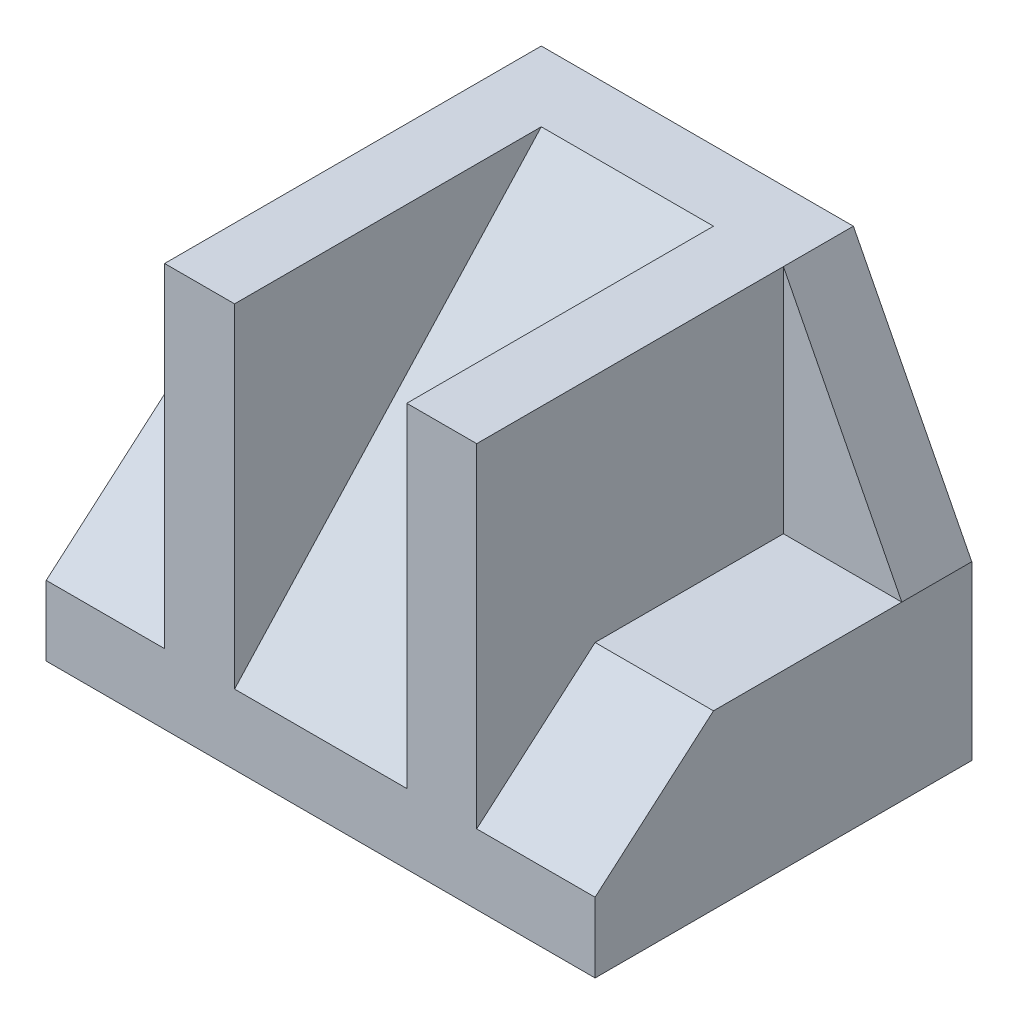
ISO-10303-21;
HEADER;
FILE_DESCRIPTION(('STEP AP214'),'2;1');
FILE_NAME('part.step','',(''),(''),'','','');
FILE_SCHEMA(('AUTOMOTIVE_DESIGN { 1 0 10303 214 1 1 1 1 }'));
ENDSEC;
DATA;
#1=APPLICATION_CONTEXT('core data for automotive mechanical design processes');
#2=APPLICATION_PROTOCOL_DEFINITION('international standard','automotive_design',2000,#1);
#3=PRODUCT_CONTEXT('',#1,'mechanical');
#4=PRODUCT('Part','Part','',(#3));
#5=PRODUCT_RELATED_PRODUCT_CATEGORY('part','',(#4));
#6=PRODUCT_DEFINITION_FORMATION('','',#4);
#7=PRODUCT_DEFINITION_CONTEXT('part definition',#1,'design');
#8=PRODUCT_DEFINITION('design','',#6,#7);
#9=PRODUCT_DEFINITION_SHAPE('','',#8);
#10=(LENGTH_UNIT() NAMED_UNIT(*) SI_UNIT(.MILLI.,.METRE.));
#11=(NAMED_UNIT(*) PLANE_ANGLE_UNIT() SI_UNIT($,.RADIAN.));
#12=(NAMED_UNIT(*) SI_UNIT($,.STERADIAN.) SOLID_ANGLE_UNIT());
#13=UNCERTAINTY_MEASURE_WITH_UNIT(LENGTH_MEASURE(1.E-05),#10,'distance_accuracy_value','');
#14=(GEOMETRIC_REPRESENTATION_CONTEXT(3) GLOBAL_UNCERTAINTY_ASSIGNED_CONTEXT((#13)) GLOBAL_UNIT_ASSIGNED_CONTEXT((#10,
#11,#12)) REPRESENTATION_CONTEXT('',''));
#15=CARTESIAN_POINT('',(0.,0.,0.));
#16=DIRECTION('',(0.,0.,1.));
#17=DIRECTION('',(1.,0.,0.));
#18=AXIS2_PLACEMENT_3D('',#15,#16,#17);
#19=CARTESIAN_POINT('',(51.,0.,-57.));
#20=DIRECTION('',(0.,0.,-1.));
#21=DIRECTION('',(-1.,0.,0.));
#22=AXIS2_PLACEMENT_3D('',#19,#20,#21);
#23=PLANE('',#22);
#24=DIRECTION('',(-0.455475804313987,-0.890248162977339,0.));
#25=VECTOR('',#24,1.);
#26=CARTESIAN_POINT('',(-29.,75.,-57.));
#27=LINE('',#26,#25);
#28=CARTESIAN_POINT('',(-29.,75.,-57.));
#29=VERTEX_POINT('',#28);
#30=CARTESIAN_POINT('',(-51.,32.,-57.));
#31=VERTEX_POINT('',#30);
#32=EDGE_CURVE('E288',#29,#31,#27,.T.);
#33=ORIENTED_EDGE('',*,*,#32,.T.);
#34=DIRECTION('',(-1.,0.,0.));
#35=VECTOR('',#34,1.);
#36=CARTESIAN_POINT('',(51.,32.,-57.));
#37=LINE('',#36,#35);
#38=CARTESIAN_POINT('',(-29.,32.,-57.));
#39=VERTEX_POINT('',#38);
#40=EDGE_CURVE('E223',#39,#31,#37,.T.);
#41=ORIENTED_EDGE('',*,*,#40,.F.);
#42=DIRECTION('',(0.,-1.,0.));
#43=VECTOR('',#42,1.);
#44=CARTESIAN_POINT('',(-29.,0.,-57.));
#45=LINE('',#44,#43);
#46=EDGE_CURVE('E170',#29,#39,#45,.T.);
#47=ORIENTED_EDGE('',*,*,#46,.F.);
#48=EDGE_LOOP('',(#33,#41,#47));
#49=FACE_BOUND('',#48,.T.);
#50=ADVANCED_FACE('F36',(#49),#23,.F.);
#51=CARTESIAN_POINT('',(51.,0.,-70.));
#52=DIRECTION('',(0.,0.,1.));
#53=DIRECTION('',(1.,0.,0.));
#54=AXIS2_PLACEMENT_3D('',#51,#52,#53);
#55=PLANE('',#54);
#56=DIRECTION('',(0.455475804313987,0.890248162977339,0.));
#57=VECTOR('',#56,1.);
#58=CARTESIAN_POINT('',(-29.,75.,-70.));
#59=LINE('',#58,#57);
#60=CARTESIAN_POINT('',(-51.,32.,-70.));
#61=VERTEX_POINT('',#60);
#62=CARTESIAN_POINT('',(-29.,75.,-70.));
#63=VERTEX_POINT('',#62);
#64=EDGE_CURVE('E51',#61,#63,#59,.T.);
#65=ORIENTED_EDGE('',*,*,#64,.T.);
#66=DIRECTION('',(-1.,0.,0.));
#67=VECTOR('',#66,1.);
#68=CARTESIAN_POINT('',(51.,75.,-70.));
#69=LINE('',#68,#67);
#70=CARTESIAN_POINT('',(29.,75.,-70.));
#71=VERTEX_POINT('',#70);
#72=EDGE_CURVE('E240',#71,#63,#69,.T.);
#73=ORIENTED_EDGE('',*,*,#72,.F.);
#74=DIRECTION('',(-0.455475804313987,0.890248162977339,0.));
#75=VECTOR('',#74,1.);
#76=CARTESIAN_POINT('',(29.,75.,-70.));
#77=LINE('',#76,#75);
#78=CARTESIAN_POINT('',(51.,32.,-70.));
#79=VERTEX_POINT('',#78);
#80=EDGE_CURVE('E187',#79,#71,#77,.T.);
#81=ORIENTED_EDGE('',*,*,#80,.F.);
#82=DIRECTION('',(0.,1.,0.));
#83=VECTOR('',#82,1.);
#84=CARTESIAN_POINT('',(51.,0.,-70.));
#85=LINE('',#84,#83);
#86=CARTESIAN_POINT('',(51.,0.,-70.));
#87=VERTEX_POINT('',#86);
#88=EDGE_CURVE('E220',#87,#79,#85,.T.);
#89=ORIENTED_EDGE('',*,*,#88,.F.);
#90=DIRECTION('',(-1.,0.,0.));
#91=VECTOR('',#90,1.);
#92=CARTESIAN_POINT('',(51.,0.,-70.));
#93=LINE('',#92,#91);
#94=CARTESIAN_POINT('',(-51.,0.,-70.));
#95=VERTEX_POINT('',#94);
#96=EDGE_CURVE('E243',#87,#95,#93,.T.);
#97=ORIENTED_EDGE('',*,*,#96,.T.);
#98=DIRECTION('',(0.,1.,0.));
#99=VECTOR('',#98,1.);
#100=CARTESIAN_POINT('',(-51.,0.,-70.));
#101=LINE('',#100,#99);
#102=EDGE_CURVE('E213',#95,#61,#101,.T.);
#103=ORIENTED_EDGE('',*,*,#102,.T.);
#104=EDGE_LOOP('',(#65,#73,#81,#89,#97,#103));
#105=FACE_BOUND('',#104,.T.);
#106=ADVANCED_FACE('F265',(#105),#55,.F.);
#107=CARTESIAN_POINT('',(51.,75.,0.));
#108=DIRECTION('',(0.,1.,0.));
#109=DIRECTION('',(0.,0.,1.));
#110=AXIS2_PLACEMENT_3D('',#107,#108,#109);
#111=PLANE('',#110);
#112=ORIENTED_EDGE('',*,*,#72,.T.);
#113=DIRECTION('',(0.,0.,1.));
#114=VECTOR('',#113,1.);
#115=CARTESIAN_POINT('',(-29.,75.,-70.001));
#116=LINE('',#115,#114);
#117=EDGE_CURVE('E168',#63,#29,#116,.T.);
#118=ORIENTED_EDGE('',*,*,#117,.T.);
#119=DIRECTION('',(0.,0.,-1.));
#120=VECTOR('',#119,1.);
#121=CARTESIAN_POINT('',(-29.,75.,0.));
#122=LINE('',#121,#120);
#123=CARTESIAN_POINT('',(-29.,75.,0.));
#124=VERTEX_POINT('',#123);
#125=EDGE_CURVE('E176',#124,#29,#122,.T.);
#126=ORIENTED_EDGE('',*,*,#125,.F.);
#127=DIRECTION('',(1.,0.,0.));
#128=VECTOR('',#127,1.);
#129=CARTESIAN_POINT('',(-29.,75.,0.));
#130=LINE('',#129,#128);
#131=CARTESIAN_POINT('',(-16.,75.,0.));
#132=VERTEX_POINT('',#131);
#133=EDGE_CURVE('E179',#124,#132,#130,.T.);
#134=ORIENTED_EDGE('',*,*,#133,.T.);
#135=DIRECTION('',(0.,0.,-1.));
#136=VECTOR('',#135,1.);
#137=CARTESIAN_POINT('',(-16.,75.,0.));
#138=LINE('',#137,#136);
#139=CARTESIAN_POINT('',(-16.,75.,-57.));
#140=VERTEX_POINT('',#139);
#141=EDGE_CURVE('E167',#132,#140,#138,.T.);
#142=ORIENTED_EDGE('',*,*,#141,.T.);
#143=DIRECTION('',(-1.,0.,0.));
#144=VECTOR('',#143,1.);
#145=CARTESIAN_POINT('',(51.,75.,-57.));
#146=LINE('',#145,#144);
#147=CARTESIAN_POINT('',(16.,75.,-57.));
#148=VERTEX_POINT('',#147);
#149=EDGE_CURVE('E148',#148,#140,#146,.T.);
#150=ORIENTED_EDGE('',*,*,#149,.F.);
#151=DIRECTION('',(0.,0.,-1.));
#152=VECTOR('',#151,1.);
#153=CARTESIAN_POINT('',(16.,75.,0.));
#154=LINE('',#153,#152);
#155=CARTESIAN_POINT('',(16.,75.,0.));
#156=VERTEX_POINT('',#155);
#157=EDGE_CURVE('E190',#156,#148,#154,.T.);
#158=ORIENTED_EDGE('',*,*,#157,.F.);
#159=DIRECTION('',(-1.,0.,0.));
#160=VECTOR('',#159,1.);
#161=CARTESIAN_POINT('',(29.,75.,0.));
#162=LINE('',#161,#160);
#163=CARTESIAN_POINT('',(29.,75.,0.));
#164=VERTEX_POINT('',#163);
#165=EDGE_CURVE('E203',#164,#156,#162,.T.);
#166=ORIENTED_EDGE('',*,*,#165,.F.);
#167=DIRECTION('',(0.,0.,-1.));
#168=VECTOR('',#167,1.);
#169=CARTESIAN_POINT('',(29.,75.,0.));
#170=LINE('',#169,#168);
#171=CARTESIAN_POINT('',(29.,75.,-57.));
#172=VERTEX_POINT('',#171);
#173=EDGE_CURVE('E193',#164,#172,#170,.T.);
#174=ORIENTED_EDGE('',*,*,#173,.T.);
#175=DIRECTION('',(0.,0.,1.));
#176=VECTOR('',#175,1.);
#177=CARTESIAN_POINT('',(29.,75.,-70.001));
#178=LINE('',#177,#176);
#179=EDGE_CURVE('E183',#71,#172,#178,.T.);
#180=ORIENTED_EDGE('',*,*,#179,.F.);
#181=EDGE_LOOP('',(#112,#118,#126,#134,#142,#150,#158,#166,#174,#180));
#182=FACE_BOUND('',#181,.T.);
#183=ADVANCED_FACE('F284',(#182),#111,.T.);
#184=CARTESIAN_POINT('',(-51.,0.,0.));
#185=DIRECTION('',(1.,0.,0.));
#186=DIRECTION('',(0.,0.,-1.));
#187=AXIS2_PLACEMENT_3D('',#184,#185,#186);
#188=PLANE('',#187);
#189=DIRECTION('',(0.,0.,1.));
#190=VECTOR('',#189,1.);
#191=CARTESIAN_POINT('',(-51.,32.,-70.001));
#192=LINE('',#191,#190);
#193=EDGE_CURVE('E173',#61,#31,#192,.T.);
#194=ORIENTED_EDGE('',*,*,#193,.F.);
#195=ORIENTED_EDGE('',*,*,#102,.F.);
#196=DIRECTION('',(0.,0.,-1.));
#197=VECTOR('',#196,1.);
#198=CARTESIAN_POINT('',(-51.,0.,0.));
#199=LINE('',#198,#197);
#200=CARTESIAN_POINT('',(-51.,0.,0.));
#201=VERTEX_POINT('',#200);
#202=EDGE_CURVE('E232',#201,#95,#199,.T.);
#203=ORIENTED_EDGE('',*,*,#202,.F.);
#204=DIRECTION('',(0.,1.,0.));
#205=VECTOR('',#204,1.);
#206=CARTESIAN_POINT('',(-51.,0.,0.));
#207=LINE('',#206,#205);
#208=CARTESIAN_POINT('',(-51.,13.,0.));
#209=VERTEX_POINT('',#208);
#210=EDGE_CURVE('E229',#201,#209,#207,.T.);
#211=ORIENTED_EDGE('',*,*,#210,.T.);
#212=DIRECTION('',(0.,-0.653619870346092,0.75682300776916));
#213=VECTOR('',#212,1.);
#214=CARTESIAN_POINT('',(-51.,7.44615384615384,6.43076923076923));
#215=LINE('',#214,#213);
#216=CARTESIAN_POINT('',(-51.,32.,-22.));
#217=VERTEX_POINT('',#216);
#218=EDGE_CURVE('E226',#217,#209,#215,.T.);
#219=ORIENTED_EDGE('',*,*,#218,.F.);
#220=DIRECTION('',(0.,0.,1.));
#221=VECTOR('',#220,1.);
#222=CARTESIAN_POINT('',(-51.,32.,0.));
#223=LINE('',#222,#221);
#224=EDGE_CURVE('E208',#31,#217,#223,.T.);
#225=ORIENTED_EDGE('',*,*,#224,.F.);
#226=EDGE_LOOP('',(#194,#195,#203,#211,#219,#225));
#227=FACE_BOUND('',#226,.T.);
#228=ADVANCED_FACE('F257',(#227),#188,.F.);
#229=CARTESIAN_POINT('',(51.,32.,0.));
#230=DIRECTION('',(0.,-1.,0.));
#231=DIRECTION('',(0.,0.,-1.));
#232=AXIS2_PLACEMENT_3D('',#229,#230,#231);
#233=PLANE('',#232);
#234=DIRECTION('',(-1.,0.,0.));
#235=VECTOR('',#234,1.);
#236=CARTESIAN_POINT('',(51.,32.,-22.));
#237=LINE('',#236,#235);
#238=CARTESIAN_POINT('',(-29.,32.,-22.));
#239=VERTEX_POINT('',#238);
#240=EDGE_CURVE('E44',#239,#217,#237,.T.);
#241=ORIENTED_EDGE('',*,*,#240,.F.);
#242=DIRECTION('',(0.,0.,1.));
#243=VECTOR('',#242,1.);
#244=CARTESIAN_POINT('',(-29.,32.,0.));
#245=LINE('',#244,#243);
#246=EDGE_CURVE('E296',#39,#239,#245,.T.);
#247=ORIENTED_EDGE('',*,*,#246,.F.);
#248=ORIENTED_EDGE('',*,*,#40,.T.);
#249=ORIENTED_EDGE('',*,*,#224,.T.);
#250=EDGE_LOOP('',(#241,#247,#248,#249));
#251=FACE_BOUND('',#250,.T.);
#252=ADVANCED_FACE('F309',(#251),#233,.F.);
#253=CARTESIAN_POINT('',(51.,7.44615384615384,6.43076923076923));
#254=DIRECTION('',(0.,-0.75682300776916,-0.653619870346092));
#255=DIRECTION('',(0.,0.653619870346092,-0.75682300776916));
#256=AXIS2_PLACEMENT_3D('',#253,#254,#255);
#257=PLANE('',#256);
#258=DIRECTION('',(-1.,0.,0.));
#259=VECTOR('',#258,1.);
#260=CARTESIAN_POINT('',(51.,13.,0.));
#261=LINE('',#260,#259);
#262=CARTESIAN_POINT('',(-29.,13.,0.));
#263=VERTEX_POINT('',#262);
#264=EDGE_CURVE('E165',#263,#209,#261,.T.);
#265=ORIENTED_EDGE('',*,*,#264,.F.);
#266=DIRECTION('',(0.,-0.653619870346092,0.75682300776916));
#267=VECTOR('',#266,1.);
#268=CARTESIAN_POINT('',(-29.,7.44615384615384,6.43076923076923));
#269=LINE('',#268,#267);
#270=EDGE_CURVE('E59',#239,#263,#269,.T.);
#271=ORIENTED_EDGE('',*,*,#270,.F.);
#272=ORIENTED_EDGE('',*,*,#240,.T.);
#273=ORIENTED_EDGE('',*,*,#218,.T.);
#274=EDGE_LOOP('',(#265,#271,#272,#273));
#275=FACE_BOUND('',#274,.T.);
#276=ADVANCED_FACE('F253',(#275),#257,.F.);
#277=CARTESIAN_POINT('',(51.,32.,-57.));
#278=VERTEX_POINT('',#277);
#279=CARTESIAN_POINT('',(29.,32.,-57.));
#280=VERTEX_POINT('',#279);
#281=EDGE_CURVE('E236',#278,#280,#37,.T.);
#282=ORIENTED_EDGE('',*,*,#281,.T.);
#283=DIRECTION('',(0.,0.,1.));
#284=VECTOR('',#283,1.);
#285=CARTESIAN_POINT('',(29.,32.,0.));
#286=LINE('',#285,#284);
#287=CARTESIAN_POINT('',(29.,32.,-22.));
#288=VERTEX_POINT('',#287);
#289=EDGE_CURVE('E201',#280,#288,#286,.T.);
#290=ORIENTED_EDGE('',*,*,#289,.T.);
#291=CARTESIAN_POINT('',(51.,32.,-22.));
#292=VERTEX_POINT('',#291);
#293=EDGE_CURVE('E11',#292,#288,#237,.T.);
#294=ORIENTED_EDGE('',*,*,#293,.F.);
#295=DIRECTION('',(0.,0.,1.));
#296=VECTOR('',#295,1.);
#297=CARTESIAN_POINT('',(51.,32.,0.));
#298=LINE('',#297,#296);
#299=EDGE_CURVE('E209',#278,#292,#298,.T.);
#300=ORIENTED_EDGE('',*,*,#299,.F.);
#301=EDGE_LOOP('',(#282,#290,#294,#300));
#302=FACE_BOUND('',#301,.T.);
#303=ADVANCED_FACE('F38',(#302),#233,.F.);
#304=ORIENTED_EDGE('',*,*,#293,.T.);
#305=DIRECTION('',(0.,-0.653619870346092,0.75682300776916));
#306=VECTOR('',#305,1.);
#307=CARTESIAN_POINT('',(29.,7.44615384615384,6.43076923076923));
#308=LINE('',#307,#306);
#309=CARTESIAN_POINT('',(29.,13.,0.));
#310=VERTEX_POINT('',#309);
#311=EDGE_CURVE('E199',#288,#310,#308,.T.);
#312=ORIENTED_EDGE('',*,*,#311,.T.);
#313=CARTESIAN_POINT('',(51.,13.,0.));
#314=VERTEX_POINT('',#313);
#315=EDGE_CURVE('E164',#314,#310,#261,.T.);
#316=ORIENTED_EDGE('',*,*,#315,.F.);
#317=DIRECTION('',(0.,-0.653619870346092,0.75682300776916));
#318=VECTOR('',#317,1.);
#319=CARTESIAN_POINT('',(51.,7.44615384615384,6.43076923076923));
#320=LINE('',#319,#318);
#321=EDGE_CURVE('E212',#292,#314,#320,.T.);
#322=ORIENTED_EDGE('',*,*,#321,.F.);
#323=EDGE_LOOP('',(#304,#312,#316,#322));
#324=FACE_BOUND('',#323,.T.);
#325=ADVANCED_FACE('F275',(#324),#257,.F.);
#326=CARTESIAN_POINT('',(51.,0.,0.));
#327=DIRECTION('',(0.,0.,1.));
#328=DIRECTION('',(1.,0.,0.));
#329=AXIS2_PLACEMENT_3D('',#326,#327,#328);
#330=PLANE('',#329);
#331=ORIENTED_EDGE('',*,*,#210,.F.);
#332=DIRECTION('',(-1.,0.,0.));
#333=VECTOR('',#332,1.);
#334=CARTESIAN_POINT('',(51.,0.,0.));
#335=LINE('',#334,#333);
#336=CARTESIAN_POINT('',(51.,0.,0.));
#337=VERTEX_POINT('',#336);
#338=EDGE_CURVE('E246',#337,#201,#335,.T.);
#339=ORIENTED_EDGE('',*,*,#338,.F.);
#340=DIRECTION('',(0.,1.,0.));
#341=VECTOR('',#340,1.);
#342=CARTESIAN_POINT('',(51.,0.,0.));
#343=LINE('',#342,#341);
#344=EDGE_CURVE('E215',#337,#314,#343,.T.);
#345=ORIENTED_EDGE('',*,*,#344,.T.);
#346=ORIENTED_EDGE('',*,*,#315,.T.);
#347=DIRECTION('',(0.,1.,0.));
#348=VECTOR('',#347,1.);
#349=CARTESIAN_POINT('',(29.,0.,0.));
#350=LINE('',#349,#348);
#351=EDGE_CURVE('E196',#310,#164,#350,.T.);
#352=ORIENTED_EDGE('',*,*,#351,.T.);
#353=ORIENTED_EDGE('',*,*,#165,.T.);
#354=DIRECTION('',(0.,1.,0.));
#355=VECTOR('',#354,1.);
#356=CARTESIAN_POINT('',(16.,0.,0.));
#357=LINE('',#356,#355);
#358=CARTESIAN_POINT('',(16.,13.,0.));
#359=VERTEX_POINT('',#358);
#360=EDGE_CURVE('E163',#359,#156,#357,.T.);
#361=ORIENTED_EDGE('',*,*,#360,.F.);
#362=CARTESIAN_POINT('',(-16.,13.,0.));
#363=VERTEX_POINT('',#362);
#364=EDGE_CURVE('E145',#359,#363,#261,.T.);
#365=ORIENTED_EDGE('',*,*,#364,.T.);
#366=DIRECTION('',(0.,1.,0.));
#367=VECTOR('',#366,1.);
#368=CARTESIAN_POINT('',(-16.,0.,0.));
#369=LINE('',#368,#367);
#370=EDGE_CURVE('E160',#363,#132,#369,.T.);
#371=ORIENTED_EDGE('',*,*,#370,.T.);
#372=ORIENTED_EDGE('',*,*,#133,.F.);
#373=DIRECTION('',(0.,1.,0.));
#374=VECTOR('',#373,1.);
#375=CARTESIAN_POINT('',(-29.,0.,0.));
#376=LINE('',#375,#374);
#377=EDGE_CURVE('E251',#263,#124,#376,.T.);
#378=ORIENTED_EDGE('',*,*,#377,.F.);
#379=ORIENTED_EDGE('',*,*,#264,.T.);
#380=EDGE_LOOP('',(#331,#339,#345,#346,#352,#353,#361,#365,#371,#372,#378,#379));
#381=FACE_BOUND('',#380,.T.);
#382=ADVANCED_FACE('F158',(#381),#330,.T.);
#383=CARTESIAN_POINT('',(51.,0.,0.));
#384=DIRECTION('',(0.,1.,0.));
#385=DIRECTION('',(0.,0.,1.));
#386=AXIS2_PLACEMENT_3D('',#383,#384,#385);
#387=PLANE('',#386);
#388=ORIENTED_EDGE('',*,*,#202,.T.);
#389=ORIENTED_EDGE('',*,*,#96,.F.);
#390=DIRECTION('',(0.,0.,-1.));
#391=VECTOR('',#390,1.);
#392=CARTESIAN_POINT('',(51.,0.,0.));
#393=LINE('',#392,#391);
#394=EDGE_CURVE('E218',#337,#87,#393,.T.);
#395=ORIENTED_EDGE('',*,*,#394,.F.);
#396=ORIENTED_EDGE('',*,*,#338,.T.);
#397=EDGE_LOOP('',(#388,#389,#395,#396));
#398=FACE_BOUND('',#397,.T.);
#399=ADVANCED_FACE('F261',(#398),#387,.F.);
#400=ORIENTED_EDGE('',*,*,#281,.F.);
#401=DIRECTION('',(0.455475804313987,-0.890248162977339,0.));
#402=VECTOR('',#401,1.);
#403=CARTESIAN_POINT('',(29.,75.,-57.));
#404=LINE('',#403,#402);
#405=EDGE_CURVE('E181',#172,#278,#404,.T.);
#406=ORIENTED_EDGE('',*,*,#405,.F.);
#407=DIRECTION('',(0.,-1.,0.));
#408=VECTOR('',#407,1.);
#409=CARTESIAN_POINT('',(29.,0.,-57.));
#410=LINE('',#409,#408);
#411=EDGE_CURVE('E191',#172,#280,#410,.T.);
#412=ORIENTED_EDGE('',*,*,#411,.T.);
#413=EDGE_LOOP('',(#400,#406,#412));
#414=FACE_BOUND('',#413,.T.);
#415=ADVANCED_FACE('F322',(#414),#23,.F.);
#416=CARTESIAN_POINT('',(51.,0.,0.));
#417=DIRECTION('',(1.,0.,0.));
#418=DIRECTION('',(0.,0.,-1.));
#419=AXIS2_PLACEMENT_3D('',#416,#417,#418);
#420=PLANE('',#419);
#421=DIRECTION('',(0.,0.,1.));
#422=VECTOR('',#421,1.);
#423=CARTESIAN_POINT('',(51.,32.,-70.001));
#424=LINE('',#423,#422);
#425=EDGE_CURVE('E184',#79,#278,#424,.T.);
#426=ORIENTED_EDGE('',*,*,#425,.T.);
#427=ORIENTED_EDGE('',*,*,#299,.T.);
#428=ORIENTED_EDGE('',*,*,#321,.T.);
#429=ORIENTED_EDGE('',*,*,#344,.F.);
#430=ORIENTED_EDGE('',*,*,#394,.T.);
#431=ORIENTED_EDGE('',*,*,#88,.T.);
#432=EDGE_LOOP('',(#426,#427,#428,#429,#430,#431));
#433=FACE_BOUND('',#432,.T.);
#434=ADVANCED_FACE('F269',(#433),#420,.T.);
#435=CARTESIAN_POINT('',(29.,0.,0.));
#436=DIRECTION('',(1.,0.,0.));
#437=DIRECTION('',(0.,0.,-1.));
#438=AXIS2_PLACEMENT_3D('',#435,#436,#437);
#439=PLANE('',#438);
#440=ORIENTED_EDGE('',*,*,#411,.F.);
#441=ORIENTED_EDGE('',*,*,#173,.F.);
#442=ORIENTED_EDGE('',*,*,#351,.F.);
#443=ORIENTED_EDGE('',*,*,#311,.F.);
#444=ORIENTED_EDGE('',*,*,#289,.F.);
#445=EDGE_LOOP('',(#440,#441,#442,#443,#444));
#446=FACE_BOUND('',#445,.T.);
#447=ADVANCED_FACE('F280',(#446),#439,.T.);
#448=CARTESIAN_POINT('',(16.,0.,0.));
#449=DIRECTION('',(1.,0.,0.));
#450=DIRECTION('',(0.,0.,-1.));
#451=AXIS2_PLACEMENT_3D('',#448,#449,#450);
#452=PLANE('',#451);
#453=ORIENTED_EDGE('',*,*,#157,.T.);
#454=DIRECTION('',(0.,0.736167617100934,-0.676799260883117));
#455=VECTOR('',#454,1.);
#456=CARTESIAN_POINT('',(16.,5.95474411391513,6.47709008881996));
#457=LINE('',#456,#455);
#458=EDGE_CURVE('E153',#359,#148,#457,.T.);
#459=ORIENTED_EDGE('',*,*,#458,.F.);
#460=ORIENTED_EDGE('',*,*,#360,.T.);
#461=EDGE_LOOP('',(#453,#459,#460));
#462=FACE_BOUND('',#461,.T.);
#463=ADVANCED_FACE('F286',(#462),#452,.F.);
#464=CARTESIAN_POINT('',(29.,75.,-70.001));
#465=DIRECTION('',(-0.890248162977339,-0.455475804313987,0.));
#466=DIRECTION('',(0.455475804313987,-0.890248162977339,0.));
#467=AXIS2_PLACEMENT_3D('',#464,#465,#466);
#468=PLANE('',#467);
#469=ORIENTED_EDGE('',*,*,#80,.T.);
#470=ORIENTED_EDGE('',*,*,#179,.T.);
#471=ORIENTED_EDGE('',*,*,#405,.T.);
#472=ORIENTED_EDGE('',*,*,#425,.F.);
#473=EDGE_LOOP('',(#469,#470,#471,#472));
#474=FACE_BOUND('',#473,.T.);
#475=ADVANCED_FACE('F354',(#474),#468,.F.);
#476=CARTESIAN_POINT('',(-29.,0.,0.));
#477=DIRECTION('',(-1.,0.,0.));
#478=DIRECTION('',(0.,0.,-1.));
#479=AXIS2_PLACEMENT_3D('',#476,#477,#478);
#480=PLANE('',#479);
#481=ORIENTED_EDGE('',*,*,#46,.T.);
#482=ORIENTED_EDGE('',*,*,#246,.T.);
#483=ORIENTED_EDGE('',*,*,#270,.T.);
#484=ORIENTED_EDGE('',*,*,#377,.T.);
#485=ORIENTED_EDGE('',*,*,#125,.T.);
#486=EDGE_LOOP('',(#481,#482,#483,#484,#485));
#487=FACE_BOUND('',#486,.T.);
#488=ADVANCED_FACE('F302',(#487),#480,.T.);
#489=CARTESIAN_POINT('',(-16.,0.,0.));
#490=DIRECTION('',(-1.,0.,0.));
#491=DIRECTION('',(0.,0.,-1.));
#492=AXIS2_PLACEMENT_3D('',#489,#490,#491);
#493=PLANE('',#492);
#494=ORIENTED_EDGE('',*,*,#370,.F.);
#495=DIRECTION('',(0.,0.736167617100934,-0.676799260883117));
#496=VECTOR('',#495,1.);
#497=CARTESIAN_POINT('',(-16.,5.95474411391513,6.47709008881996));
#498=LINE('',#497,#496);
#499=EDGE_CURVE('E142',#363,#140,#498,.T.);
#500=ORIENTED_EDGE('',*,*,#499,.T.);
#501=ORIENTED_EDGE('',*,*,#141,.F.);
#502=EDGE_LOOP('',(#494,#500,#501));
#503=FACE_BOUND('',#502,.T.);
#504=ADVANCED_FACE('F166',(#503),#493,.F.);
#505=CARTESIAN_POINT('',(-29.,75.,-70.001));
#506=DIRECTION('',(-0.890248162977339,0.455475804313987,0.));
#507=DIRECTION('',(-0.455475804313987,-0.890248162977339,0.));
#508=AXIS2_PLACEMENT_3D('',#505,#506,#507);
#509=PLANE('',#508);
#510=ORIENTED_EDGE('',*,*,#193,.T.);
#511=ORIENTED_EDGE('',*,*,#32,.F.);
#512=ORIENTED_EDGE('',*,*,#117,.F.);
#513=ORIENTED_EDGE('',*,*,#64,.F.);
#514=EDGE_LOOP('',(#510,#511,#512,#513));
#515=FACE_BOUND('',#514,.T.);
#516=ADVANCED_FACE('F310',(#515),#509,.T.);
#517=CARTESIAN_POINT('',(16.,5.95474411391513,6.47709008881996));
#518=DIRECTION('',(0.,0.676799260883117,0.736167617100934));
#519=DIRECTION('',(0.,-0.736167617100934,0.676799260883117));
#520=AXIS2_PLACEMENT_3D('',#517,#518,#519);
#521=PLANE('',#520);
#522=ORIENTED_EDGE('',*,*,#149,.T.);
#523=ORIENTED_EDGE('',*,*,#499,.F.);
#524=ORIENTED_EDGE('',*,*,#364,.F.);
#525=ORIENTED_EDGE('',*,*,#458,.T.);
#526=EDGE_LOOP('',(#522,#523,#524,#525));
#527=FACE_BOUND('',#526,.T.);
#528=ADVANCED_FACE('F144',(#527),#521,.T.);
#529=CLOSED_SHELL('',(#50,#106,#183,#228,#252,#276,#303,#325,#382,#399,#415,#434,#447,#463,#475,
#488,#504,#516,#528));
#530=MANIFOLD_SOLID_BREP('B2',#529);
#531=ADVANCED_BREP_SHAPE_REPRESENTATION('',(#18,#530),#14);
#532=SHAPE_DEFINITION_REPRESENTATION(#9,#531);
ENDSEC;
END-ISO-10303-21;
